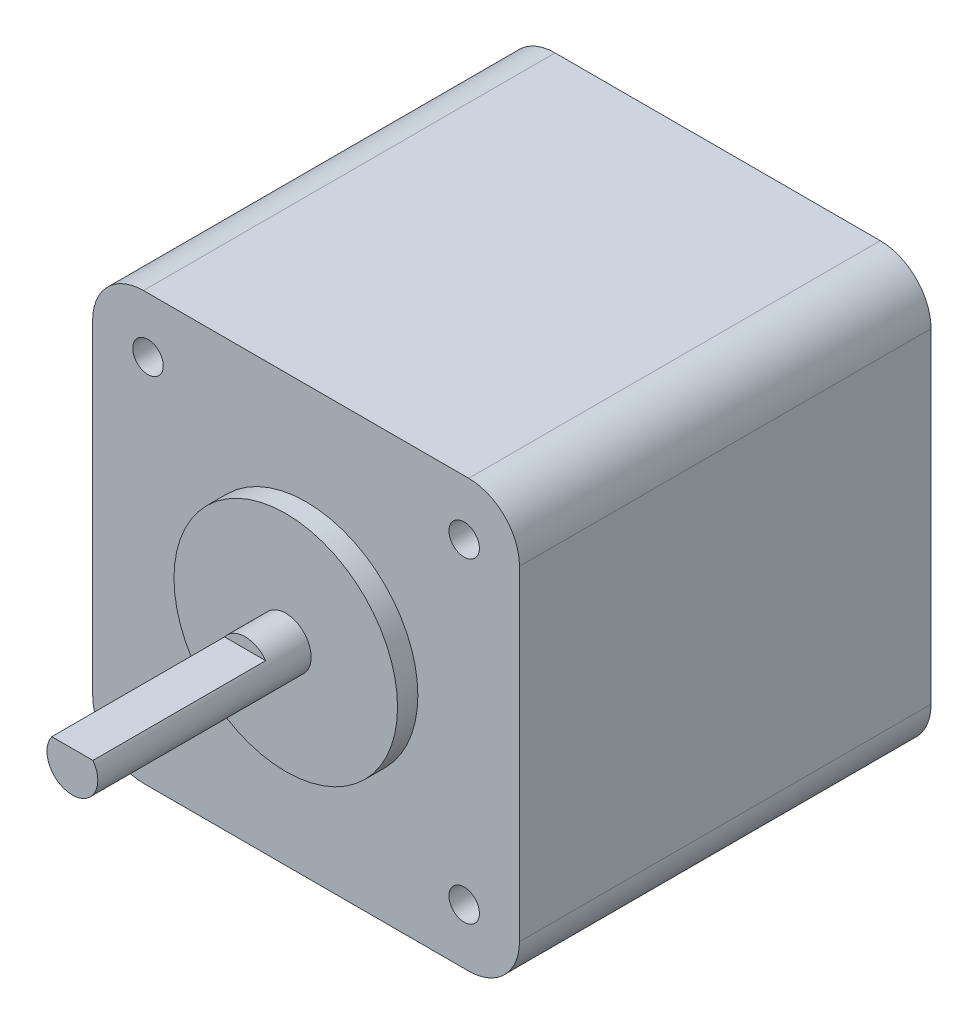
ISO-10303-21;
HEADER;
FILE_DESCRIPTION(('STEP AP214'),'2;1');
FILE_NAME('part.step','',(''),(''),'','','');
FILE_SCHEMA(('AUTOMOTIVE_DESIGN { 1 0 10303 214 1 1 1 1 }'));
ENDSEC;
DATA;
#1=APPLICATION_CONTEXT('core data for automotive mechanical design processes');
#2=APPLICATION_PROTOCOL_DEFINITION('international standard','automotive_design',2000,#1);
#3=PRODUCT_CONTEXT('',#1,'mechanical');
#4=PRODUCT('Part','Part','',(#3));
#5=PRODUCT_RELATED_PRODUCT_CATEGORY('part','',(#4));
#6=PRODUCT_DEFINITION_FORMATION('','',#4);
#7=PRODUCT_DEFINITION_CONTEXT('part definition',#1,'design');
#8=PRODUCT_DEFINITION('design','',#6,#7);
#9=PRODUCT_DEFINITION_SHAPE('','',#8);
#10=(LENGTH_UNIT() NAMED_UNIT(*) SI_UNIT(.MILLI.,.METRE.));
#11=(NAMED_UNIT(*) PLANE_ANGLE_UNIT() SI_UNIT($,.RADIAN.));
#12=(NAMED_UNIT(*) SI_UNIT($,.STERADIAN.) SOLID_ANGLE_UNIT());
#13=UNCERTAINTY_MEASURE_WITH_UNIT(LENGTH_MEASURE(1.E-05),#10,'distance_accuracy_value','');
#14=(GEOMETRIC_REPRESENTATION_CONTEXT(3) GLOBAL_UNCERTAINTY_ASSIGNED_CONTEXT((#13)) GLOBAL_UNIT_ASSIGNED_CONTEXT((#10,
#11,#12)) REPRESENTATION_CONTEXT('',''));
#15=CARTESIAN_POINT('',(0.,0.,0.));
#16=DIRECTION('',(0.,0.,1.));
#17=DIRECTION('',(1.,0.,0.));
#18=AXIS2_PLACEMENT_3D('',#15,#16,#17);
#19=CARTESIAN_POINT('',(21.,-21.,40.5));
#20=DIRECTION('',(-1.,0.,0.));
#21=DIRECTION('',(0.,0.,1.));
#22=AXIS2_PLACEMENT_3D('',#19,#20,#21);
#23=PLANE('',#22);
#24=DIRECTION('',(0.,1.,0.));
#25=VECTOR('',#24,1.);
#26=CARTESIAN_POINT('',(21.,-21.,40.5));
#27=LINE('',#26,#25);
#28=CARTESIAN_POINT('',(21.,-16.,40.5));
#29=VERTEX_POINT('',#28);
#30=CARTESIAN_POINT('',(21.,16.,40.5));
#31=VERTEX_POINT('',#30);
#32=EDGE_CURVE('E163',#29,#31,#27,.T.);
#33=ORIENTED_EDGE('',*,*,#32,.F.);
#34=DIRECTION('',(0.,0.,-1.));
#35=VECTOR('',#34,1.);
#36=CARTESIAN_POINT('',(21.,-16.,40.5));
#37=LINE('',#36,#35);
#38=CARTESIAN_POINT('',(21.,-16.,0.));
#39=VERTEX_POINT('',#38);
#40=EDGE_CURVE('E215',#29,#39,#37,.T.);
#41=ORIENTED_EDGE('',*,*,#40,.T.);
#42=DIRECTION('',(0.,1.,0.));
#43=VECTOR('',#42,1.);
#44=CARTESIAN_POINT('',(21.,-21.,0.));
#45=LINE('',#44,#43);
#46=CARTESIAN_POINT('',(21.,16.,0.));
#47=VERTEX_POINT('',#46);
#48=EDGE_CURVE('E162',#39,#47,#45,.T.);
#49=ORIENTED_EDGE('',*,*,#48,.T.);
#50=DIRECTION('',(0.,0.,-1.));
#51=VECTOR('',#50,1.);
#52=CARTESIAN_POINT('',(21.,16.,40.5));
#53=LINE('',#52,#51);
#54=EDGE_CURVE('E213',#47,#31,#53,.F.);
#55=ORIENTED_EDGE('',*,*,#54,.T.);
#56=EDGE_LOOP('',(#33,#41,#49,#55));
#57=FACE_BOUND('',#56,.T.);
#58=ADVANCED_FACE('F33',(#57),#23,.F.);
#59=CARTESIAN_POINT('',(-21.,21.,40.5));
#60=DIRECTION('',(0.,-1.,0.));
#61=DIRECTION('',(0.,0.,-1.));
#62=AXIS2_PLACEMENT_3D('',#59,#60,#61);
#63=PLANE('',#62);
#64=DIRECTION('',(-1.,0.,0.));
#65=VECTOR('',#64,1.);
#66=CARTESIAN_POINT('',(-21.,21.,40.5));
#67=LINE('',#66,#65);
#68=CARTESIAN_POINT('',(16.,21.,40.5));
#69=VERTEX_POINT('',#68);
#70=CARTESIAN_POINT('',(-16.,21.,40.5));
#71=VERTEX_POINT('',#70);
#72=EDGE_CURVE('E166',#69,#71,#67,.T.);
#73=ORIENTED_EDGE('',*,*,#72,.F.);
#74=DIRECTION('',(0.,0.,-1.));
#75=VECTOR('',#74,1.);
#76=CARTESIAN_POINT('',(16.,21.,40.5));
#77=LINE('',#76,#75);
#78=CARTESIAN_POINT('',(16.,21.,0.));
#79=VERTEX_POINT('',#78);
#80=EDGE_CURVE('E11',#69,#79,#77,.T.);
#81=ORIENTED_EDGE('',*,*,#80,.T.);
#82=DIRECTION('',(-1.,0.,0.));
#83=VECTOR('',#82,1.);
#84=CARTESIAN_POINT('',(-21.,21.,0.));
#85=LINE('',#84,#83);
#86=CARTESIAN_POINT('',(-16.,21.,0.));
#87=VERTEX_POINT('',#86);
#88=EDGE_CURVE('E178',#79,#87,#85,.T.);
#89=ORIENTED_EDGE('',*,*,#88,.T.);
#90=DIRECTION('',(0.,0.,-1.));
#91=VECTOR('',#90,1.);
#92=CARTESIAN_POINT('',(-16.,21.,40.5));
#93=LINE('',#92,#91);
#94=EDGE_CURVE('E41',#87,#71,#93,.F.);
#95=ORIENTED_EDGE('',*,*,#94,.T.);
#96=EDGE_LOOP('',(#73,#81,#89,#95));
#97=FACE_BOUND('',#96,.T.);
#98=ADVANCED_FACE('F232',(#97),#63,.F.);
#99=CARTESIAN_POINT('',(-21.,-21.,40.5));
#100=DIRECTION('',(1.,0.,0.));
#101=DIRECTION('',(0.,0.,-1.));
#102=AXIS2_PLACEMENT_3D('',#99,#100,#101);
#103=PLANE('',#102);
#104=DIRECTION('',(0.,-1.,0.));
#105=VECTOR('',#104,1.);
#106=CARTESIAN_POINT('',(-21.,-21.,0.));
#107=LINE('',#106,#105);
#108=CARTESIAN_POINT('',(-21.,16.,0.));
#109=VERTEX_POINT('',#108);
#110=CARTESIAN_POINT('',(-21.,-16.,0.));
#111=VERTEX_POINT('',#110);
#112=EDGE_CURVE('E180',#109,#111,#107,.T.);
#113=ORIENTED_EDGE('',*,*,#112,.T.);
#114=DIRECTION('',(0.,0.,-1.));
#115=VECTOR('',#114,1.);
#116=CARTESIAN_POINT('',(-21.,-16.,40.5));
#117=LINE('',#116,#115);
#118=CARTESIAN_POINT('',(-21.,-16.,40.5));
#119=VERTEX_POINT('',#118);
#120=EDGE_CURVE('E203',#111,#119,#117,.F.);
#121=ORIENTED_EDGE('',*,*,#120,.T.);
#122=DIRECTION('',(0.,-1.,0.));
#123=VECTOR('',#122,1.);
#124=CARTESIAN_POINT('',(-21.,-21.,40.5));
#125=LINE('',#124,#123);
#126=CARTESIAN_POINT('',(-21.,16.,40.5));
#127=VERTEX_POINT('',#126);
#128=EDGE_CURVE('E169',#127,#119,#125,.T.);
#129=ORIENTED_EDGE('',*,*,#128,.F.);
#130=DIRECTION('',(0.,0.,-1.));
#131=VECTOR('',#130,1.);
#132=CARTESIAN_POINT('',(-21.,16.,40.5));
#133=LINE('',#132,#131);
#134=EDGE_CURVE('E200',#127,#109,#133,.T.);
#135=ORIENTED_EDGE('',*,*,#134,.T.);
#136=EDGE_LOOP('',(#113,#121,#129,#135));
#137=FACE_BOUND('',#136,.T.);
#138=ADVANCED_FACE('F241',(#137),#103,.F.);
#139=CARTESIAN_POINT('',(-21.,-21.,40.5));
#140=DIRECTION('',(0.,1.,0.));
#141=DIRECTION('',(0.,0.,1.));
#142=AXIS2_PLACEMENT_3D('',#139,#140,#141);
#143=PLANE('',#142);
#144=DIRECTION('',(1.,0.,0.));
#145=VECTOR('',#144,1.);
#146=CARTESIAN_POINT('',(-21.,-21.,40.5));
#147=LINE('',#146,#145);
#148=CARTESIAN_POINT('',(-16.,-21.,40.5));
#149=VERTEX_POINT('',#148);
#150=CARTESIAN_POINT('',(16.,-21.,40.5));
#151=VERTEX_POINT('',#150);
#152=EDGE_CURVE('E172',#149,#151,#147,.T.);
#153=ORIENTED_EDGE('',*,*,#152,.F.);
#154=DIRECTION('',(0.,0.,-1.));
#155=VECTOR('',#154,1.);
#156=CARTESIAN_POINT('',(-16.,-21.,40.5));
#157=LINE('',#156,#155);
#158=CARTESIAN_POINT('',(-16.,-21.,0.));
#159=VERTEX_POINT('',#158);
#160=EDGE_CURVE('E189',#149,#159,#157,.T.);
#161=ORIENTED_EDGE('',*,*,#160,.T.);
#162=DIRECTION('',(1.,0.,0.));
#163=VECTOR('',#162,1.);
#164=CARTESIAN_POINT('',(-21.,-21.,0.));
#165=LINE('',#164,#163);
#166=CARTESIAN_POINT('',(16.,-21.,0.));
#167=VERTEX_POINT('',#166);
#168=EDGE_CURVE('E167',#159,#167,#165,.T.);
#169=ORIENTED_EDGE('',*,*,#168,.T.);
#170=DIRECTION('',(0.,0.,-1.));
#171=VECTOR('',#170,1.);
#172=CARTESIAN_POINT('',(16.,-21.,40.5));
#173=LINE('',#172,#171);
#174=EDGE_CURVE('E187',#167,#151,#173,.F.);
#175=ORIENTED_EDGE('',*,*,#174,.T.);
#176=EDGE_LOOP('',(#153,#161,#169,#175));
#177=FACE_BOUND('',#176,.T.);
#178=ADVANCED_FACE('F249',(#177),#143,.F.);
#179=CARTESIAN_POINT('',(0.,0.,40.5));
#180=DIRECTION('',(0.,0.,-1.));
#181=DIRECTION('',(-1.,0.,0.));
#182=AXIS2_PLACEMENT_3D('',#179,#180,#181);
#183=PLANE('',#182);
#184=CARTESIAN_POINT('',(-15.5563491861041,15.556349186104,40.5));
#185=DIRECTION('',(0.,0.,1.));
#186=DIRECTION('',(1.,0.,0.));
#187=AXIS2_PLACEMENT_3D('',#184,#185,#186);
#188=CIRCLE('',#187,1.5);
#189=CARTESIAN_POINT('',(-14.0563491861041,15.556349186104,40.5));
#190=VERTEX_POINT('',#189);
#191=EDGE_CURVE('E128',#190,#190,#188,.T.);
#192=ORIENTED_EDGE('',*,*,#191,.F.);
#193=EDGE_LOOP('',(#192));
#194=FACE_BOUND('',#193,.T.);
#195=CARTESIAN_POINT('',(15.5563491861041,-15.556349186104,40.5));
#196=DIRECTION('',(0.,0.,1.));
#197=DIRECTION('',(1.,0.,0.));
#198=AXIS2_PLACEMENT_3D('',#195,#196,#197);
#199=CIRCLE('',#198,1.5);
#200=CARTESIAN_POINT('',(17.0563491861041,-15.556349186104,40.5));
#201=VERTEX_POINT('',#200);
#202=EDGE_CURVE('E136',#201,#201,#199,.T.);
#203=ORIENTED_EDGE('',*,*,#202,.F.);
#204=EDGE_LOOP('',(#203));
#205=FACE_BOUND('',#204,.T.);
#206=CARTESIAN_POINT('',(-15.5563491861041,-15.556349186104,40.5));
#207=DIRECTION('',(0.,0.,1.));
#208=DIRECTION('',(1.,0.,0.));
#209=AXIS2_PLACEMENT_3D('',#206,#207,#208);
#210=CIRCLE('',#209,1.5);
#211=CARTESIAN_POINT('',(-14.0563491861041,-15.556349186104,40.5));
#212=VERTEX_POINT('',#211);
#213=EDGE_CURVE('E135',#212,#212,#210,.T.);
#214=ORIENTED_EDGE('',*,*,#213,.F.);
#215=EDGE_LOOP('',(#214));
#216=FACE_BOUND('',#215,.T.);
#217=CARTESIAN_POINT('',(15.5563491861041,15.556349186104,40.5));
#218=DIRECTION('',(0.,0.,1.));
#219=DIRECTION('',(1.,0.,0.));
#220=AXIS2_PLACEMENT_3D('',#217,#218,#219);
#221=CIRCLE('',#220,1.5);
#222=CARTESIAN_POINT('',(17.0563491861041,15.556349186104,40.5));
#223=VERTEX_POINT('',#222);
#224=EDGE_CURVE('E147',#223,#223,#221,.T.);
#225=ORIENTED_EDGE('',*,*,#224,.F.);
#226=EDGE_LOOP('',(#225));
#227=FACE_BOUND('',#226,.T.);
#228=CARTESIAN_POINT('',(0.,0.,40.5));
#229=DIRECTION('',(0.,0.,-1.));
#230=DIRECTION('',(-1.,0.,0.));
#231=AXIS2_PLACEMENT_3D('',#228,#229,#230);
#232=CIRCLE('',#231,11.);
#233=CARTESIAN_POINT('',(-11.,0.,40.5));
#234=VERTEX_POINT('',#233);
#235=EDGE_CURVE('E175',#234,#234,#232,.F.);
#236=ORIENTED_EDGE('',*,*,#235,.F.);
#237=EDGE_LOOP('',(#236));
#238=FACE_BOUND('',#237,.T.);
#239=ORIENTED_EDGE('',*,*,#128,.T.);
#240=CARTESIAN_POINT('',(-16.,-16.,40.5));
#241=DIRECTION('',(0.,0.,-1.));
#242=DIRECTION('',(-1.,0.,0.));
#243=AXIS2_PLACEMENT_3D('',#240,#241,#242);
#244=CIRCLE('',#243,5.);
#245=EDGE_CURVE('E211',#119,#149,#244,.F.);
#246=ORIENTED_EDGE('',*,*,#245,.T.);
#247=ORIENTED_EDGE('',*,*,#152,.T.);
#248=CARTESIAN_POINT('',(16.,-16.,40.5));
#249=DIRECTION('',(0.,0.,-1.));
#250=DIRECTION('',(-1.,0.,0.));
#251=AXIS2_PLACEMENT_3D('',#248,#249,#250);
#252=CIRCLE('',#251,5.);
#253=EDGE_CURVE('E209',#151,#29,#252,.F.);
#254=ORIENTED_EDGE('',*,*,#253,.T.);
#255=ORIENTED_EDGE('',*,*,#32,.T.);
#256=CARTESIAN_POINT('',(16.,16.,40.5));
#257=DIRECTION('',(0.,0.,-1.));
#258=DIRECTION('',(-1.,0.,0.));
#259=AXIS2_PLACEMENT_3D('',#256,#257,#258);
#260=CIRCLE('',#259,5.);
#261=EDGE_CURVE('E207',#31,#69,#260,.F.);
#262=ORIENTED_EDGE('',*,*,#261,.T.);
#263=ORIENTED_EDGE('',*,*,#72,.T.);
#264=CARTESIAN_POINT('',(-16.,16.,40.5));
#265=DIRECTION('',(0.,0.,-1.));
#266=DIRECTION('',(-1.,0.,0.));
#267=AXIS2_PLACEMENT_3D('',#264,#265,#266);
#268=CIRCLE('',#267,5.);
#269=EDGE_CURVE('E205',#71,#127,#268,.F.);
#270=ORIENTED_EDGE('',*,*,#269,.T.);
#271=EDGE_LOOP('',(#239,#246,#247,#254,#255,#262,#263,#270));
#272=FACE_BOUND('',#271,.T.);
#273=ADVANCED_FACE('F235',(#194,#205,#216,#227,#238,#272),#183,.F.);
#274=CARTESIAN_POINT('',(0.,0.,0.));
#275=DIRECTION('',(0.,0.,-1.));
#276=DIRECTION('',(-1.,0.,0.));
#277=AXIS2_PLACEMENT_3D('',#274,#275,#276);
#278=PLANE('',#277);
#279=ORIENTED_EDGE('',*,*,#168,.F.);
#280=CARTESIAN_POINT('',(-16.,-16.,0.));
#281=DIRECTION('',(0.,0.,-1.));
#282=DIRECTION('',(-1.,0.,0.));
#283=AXIS2_PLACEMENT_3D('',#280,#281,#282);
#284=CIRCLE('',#283,5.);
#285=EDGE_CURVE('E198',#159,#111,#284,.T.);
#286=ORIENTED_EDGE('',*,*,#285,.T.);
#287=ORIENTED_EDGE('',*,*,#112,.F.);
#288=CARTESIAN_POINT('',(-16.,16.,0.));
#289=DIRECTION('',(0.,0.,-1.));
#290=DIRECTION('',(-1.,0.,0.));
#291=AXIS2_PLACEMENT_3D('',#288,#289,#290);
#292=CIRCLE('',#291,5.);
#293=EDGE_CURVE('E192',#109,#87,#292,.T.);
#294=ORIENTED_EDGE('',*,*,#293,.T.);
#295=ORIENTED_EDGE('',*,*,#88,.F.);
#296=CARTESIAN_POINT('',(16.,16.,0.));
#297=DIRECTION('',(0.,0.,-1.));
#298=DIRECTION('',(-1.,0.,0.));
#299=AXIS2_PLACEMENT_3D('',#296,#297,#298);
#300=CIRCLE('',#299,5.);
#301=EDGE_CURVE('E194',#79,#47,#300,.T.);
#302=ORIENTED_EDGE('',*,*,#301,.T.);
#303=ORIENTED_EDGE('',*,*,#48,.F.);
#304=CARTESIAN_POINT('',(16.,-16.,0.));
#305=DIRECTION('',(0.,0.,-1.));
#306=DIRECTION('',(-1.,0.,0.));
#307=AXIS2_PLACEMENT_3D('',#304,#305,#306);
#308=CIRCLE('',#307,5.);
#309=EDGE_CURVE('E196',#39,#167,#308,.T.);
#310=ORIENTED_EDGE('',*,*,#309,.T.);
#311=EDGE_LOOP('',(#279,#286,#287,#294,#295,#302,#303,#310));
#312=FACE_BOUND('',#311,.T.);
#313=ADVANCED_FACE('F226',(#312),#278,.T.);
#314=CARTESIAN_POINT('',(0.,0.,42.5));
#315=DIRECTION('',(0.,0.,-1.));
#316=DIRECTION('',(-1.,0.,0.));
#317=AXIS2_PLACEMENT_3D('',#314,#315,#316);
#318=CYLINDRICAL_SURFACE('',#317,11.);
#319=CARTESIAN_POINT('',(0.,0.,42.5));
#320=DIRECTION('',(0.,0.,1.));
#321=DIRECTION('',(1.,0.,0.));
#322=AXIS2_PLACEMENT_3D('',#319,#320,#321);
#323=CIRCLE('',#322,11.);
#324=CARTESIAN_POINT('',(11.,0.,42.5));
#325=VERTEX_POINT('',#324);
#326=EDGE_CURVE('E157',#325,#325,#323,.T.);
#327=ORIENTED_EDGE('',*,*,#326,.F.);
#328=EDGE_LOOP('',(#327));
#329=FACE_BOUND('',#328,.T.);
#330=ORIENTED_EDGE('',*,*,#235,.T.);
#331=EDGE_LOOP('',(#330));
#332=FACE_BOUND('',#331,.T.);
#333=ADVANCED_FACE('F273',(#329,#332),#318,.T.);
#334=CARTESIAN_POINT('',(0.,0.,42.5));
#335=DIRECTION('',(0.,0.,1.));
#336=DIRECTION('',(1.,0.,0.));
#337=AXIS2_PLACEMENT_3D('',#334,#335,#336);
#338=PLANE('',#337);
#339=CARTESIAN_POINT('',(0.,0.,42.5));
#340=DIRECTION('',(0.,0.,1.));
#341=DIRECTION('',(1.,0.,0.));
#342=AXIS2_PLACEMENT_3D('',#339,#340,#341);
#343=CIRCLE('',#342,2.5);
#344=CARTESIAN_POINT('',(2.5,0.,42.5));
#345=VERTEX_POINT('',#344);
#346=EDGE_CURVE('E153',#345,#345,#343,.T.);
#347=ORIENTED_EDGE('',*,*,#346,.F.);
#348=EDGE_LOOP('',(#347));
#349=FACE_BOUND('',#348,.T.);
#350=ORIENTED_EDGE('',*,*,#326,.T.);
#351=EDGE_LOOP('',(#350));
#352=FACE_BOUND('',#351,.T.);
#353=ADVANCED_FACE('F279',(#349,#352),#338,.T.);
#354=CARTESIAN_POINT('',(0.,0.,63.5));
#355=DIRECTION('',(0.,0.,-1.));
#356=DIRECTION('',(-1.,0.,0.));
#357=AXIS2_PLACEMENT_3D('',#354,#355,#356);
#358=CYLINDRICAL_SURFACE('',#357,2.5);
#359=CARTESIAN_POINT('',(0.,0.,63.5));
#360=DIRECTION('',(0.,0.,1.));
#361=DIRECTION('',(1.,0.,0.));
#362=AXIS2_PLACEMENT_3D('',#359,#360,#361);
#363=CIRCLE('',#362,2.5);
#364=CARTESIAN_POINT('',(-2.02466671372052,1.46653492912789,63.5));
#365=VERTEX_POINT('',#364);
#366=CARTESIAN_POINT('',(2.02466671372052,1.46653492912789,63.5));
#367=VERTEX_POINT('',#366);
#368=EDGE_CURVE('E126',#365,#367,#363,.T.);
#369=ORIENTED_EDGE('',*,*,#368,.F.);
#370=DIRECTION('',(0.,0.,1.));
#371=VECTOR('',#370,1.);
#372=CARTESIAN_POINT('',(-2.02466671372052,1.46653492912789,46.5));
#373=LINE('',#372,#371);
#374=CARTESIAN_POINT('',(-2.02466671372052,1.46653492912789,46.5));
#375=VERTEX_POINT('',#374);
#376=EDGE_CURVE('E48',#375,#365,#373,.T.);
#377=ORIENTED_EDGE('',*,*,#376,.F.);
#378=CARTESIAN_POINT('',(0.,0.,46.5));
#379=DIRECTION('',(0.,0.,1.));
#380=DIRECTION('',(1.,0.,0.));
#381=AXIS2_PLACEMENT_3D('',#378,#379,#380);
#382=CIRCLE('',#381,2.5);
#383=CARTESIAN_POINT('',(2.02466671372052,1.46653492912789,46.5));
#384=VERTEX_POINT('',#383);
#385=EDGE_CURVE('E112',#384,#375,#382,.T.);
#386=ORIENTED_EDGE('',*,*,#385,.F.);
#387=DIRECTION('',(0.,0.,1.));
#388=VECTOR('',#387,1.);
#389=CARTESIAN_POINT('',(2.02466671372052,1.46653492912789,46.5));
#390=LINE('',#389,#388);
#391=EDGE_CURVE('E120',#384,#367,#390,.T.);
#392=ORIENTED_EDGE('',*,*,#391,.T.);
#393=EDGE_LOOP('',(#369,#377,#386,#392));
#394=FACE_BOUND('',#393,.T.);
#395=ORIENTED_EDGE('',*,*,#346,.T.);
#396=EDGE_LOOP('',(#395));
#397=FACE_BOUND('',#396,.T.);
#398=ADVANCED_FACE('F123',(#394,#397),#358,.T.);
#399=CARTESIAN_POINT('',(0.,0.,63.5));
#400=DIRECTION('',(0.,0.,1.));
#401=DIRECTION('',(1.,0.,0.));
#402=AXIS2_PLACEMENT_3D('',#399,#400,#401);
#403=PLANE('',#402);
#404=DIRECTION('',(1.,0.,0.));
#405=VECTOR('',#404,1.);
#406=CARTESIAN_POINT('',(-2.02466671372052,1.46653492912789,63.5));
#407=LINE('',#406,#405);
#408=EDGE_CURVE('E117',#365,#367,#407,.T.);
#409=ORIENTED_EDGE('',*,*,#408,.F.);
#410=ORIENTED_EDGE('',*,*,#368,.T.);
#411=EDGE_LOOP('',(#409,#410));
#412=FACE_BOUND('',#411,.T.);
#413=ADVANCED_FACE('F258',(#412),#403,.T.);
#414=CARTESIAN_POINT('',(-16.,-16.,40.5));
#415=DIRECTION('',(0.,0.,-1.));
#416=DIRECTION('',(-1.,0.,0.));
#417=AXIS2_PLACEMENT_3D('',#414,#415,#416);
#418=CYLINDRICAL_SURFACE('',#417,5.);
#419=ORIENTED_EDGE('',*,*,#245,.F.);
#420=ORIENTED_EDGE('',*,*,#120,.F.);
#421=ORIENTED_EDGE('',*,*,#285,.F.);
#422=ORIENTED_EDGE('',*,*,#160,.F.);
#423=EDGE_LOOP('',(#419,#420,#421,#422));
#424=FACE_BOUND('',#423,.T.);
#425=ADVANCED_FACE('F246',(#424),#418,.T.);
#426=CARTESIAN_POINT('',(16.,-16.,40.5));
#427=DIRECTION('',(0.,0.,-1.));
#428=DIRECTION('',(-1.,0.,0.));
#429=AXIS2_PLACEMENT_3D('',#426,#427,#428);
#430=CYLINDRICAL_SURFACE('',#429,5.);
#431=ORIENTED_EDGE('',*,*,#253,.F.);
#432=ORIENTED_EDGE('',*,*,#174,.F.);
#433=ORIENTED_EDGE('',*,*,#309,.F.);
#434=ORIENTED_EDGE('',*,*,#40,.F.);
#435=EDGE_LOOP('',(#431,#432,#433,#434));
#436=FACE_BOUND('',#435,.T.);
#437=ADVANCED_FACE('F251',(#436),#430,.T.);
#438=CARTESIAN_POINT('',(16.,16.,40.5));
#439=DIRECTION('',(0.,0.,-1.));
#440=DIRECTION('',(-1.,0.,0.));
#441=AXIS2_PLACEMENT_3D('',#438,#439,#440);
#442=CYLINDRICAL_SURFACE('',#441,5.);
#443=ORIENTED_EDGE('',*,*,#261,.F.);
#444=ORIENTED_EDGE('',*,*,#54,.F.);
#445=ORIENTED_EDGE('',*,*,#301,.F.);
#446=ORIENTED_EDGE('',*,*,#80,.F.);
#447=EDGE_LOOP('',(#443,#444,#445,#446));
#448=FACE_BOUND('',#447,.T.);
#449=ADVANCED_FACE('F231',(#448),#442,.T.);
#450=CARTESIAN_POINT('',(-16.,16.,40.5));
#451=DIRECTION('',(0.,0.,-1.));
#452=DIRECTION('',(-1.,0.,0.));
#453=AXIS2_PLACEMENT_3D('',#450,#451,#452);
#454=CYLINDRICAL_SURFACE('',#453,5.);
#455=ORIENTED_EDGE('',*,*,#269,.F.);
#456=ORIENTED_EDGE('',*,*,#94,.F.);
#457=ORIENTED_EDGE('',*,*,#293,.F.);
#458=ORIENTED_EDGE('',*,*,#134,.F.);
#459=EDGE_LOOP('',(#455,#456,#457,#458));
#460=FACE_BOUND('',#459,.T.);
#461=ADVANCED_FACE('F35',(#460),#454,.T.);
#462=CARTESIAN_POINT('',(15.5563491861041,15.556349186104,30.5));
#463=DIRECTION('',(0.,0.,1.));
#464=DIRECTION('',(1.,0.,0.));
#465=AXIS2_PLACEMENT_3D('',#462,#463,#464);
#466=CYLINDRICAL_SURFACE('',#465,1.5);
#467=CARTESIAN_POINT('',(15.5563491861041,15.556349186104,30.5));
#468=DIRECTION('',(0.,0.,1.));
#469=DIRECTION('',(1.,0.,0.));
#470=AXIS2_PLACEMENT_3D('',#467,#468,#469);
#471=CIRCLE('',#470,1.5);
#472=CARTESIAN_POINT('',(17.0563491861041,15.556349186104,30.5));
#473=VERTEX_POINT('',#472);
#474=EDGE_CURVE('E150',#473,#473,#471,.T.);
#475=ORIENTED_EDGE('',*,*,#474,.F.);
#476=EDGE_LOOP('',(#475));
#477=FACE_BOUND('',#476,.T.);
#478=ORIENTED_EDGE('',*,*,#224,.T.);
#479=EDGE_LOOP('',(#478));
#480=FACE_BOUND('',#479,.T.);
#481=ADVANCED_FACE('F289',(#477,#480),#466,.F.);
#482=CARTESIAN_POINT('',(15.5563491861041,15.556349186104,30.5));
#483=DIRECTION('',(0.,0.,1.));
#484=DIRECTION('',(1.,0.,0.));
#485=AXIS2_PLACEMENT_3D('',#482,#483,#484);
#486=PLANE('',#485);
#487=ORIENTED_EDGE('',*,*,#474,.T.);
#488=EDGE_LOOP('',(#487));
#489=FACE_BOUND('',#488,.T.);
#490=ADVANCED_FACE('F292',(#489),#486,.T.);
#491=CARTESIAN_POINT('',(-15.5563491861041,-15.556349186104,30.5));
#492=DIRECTION('',(0.,0.,1.));
#493=DIRECTION('',(1.,0.,0.));
#494=AXIS2_PLACEMENT_3D('',#491,#492,#493);
#495=CYLINDRICAL_SURFACE('',#494,1.5);
#496=CARTESIAN_POINT('',(-15.5563491861041,-15.556349186104,30.5));
#497=DIRECTION('',(0.,0.,1.));
#498=DIRECTION('',(1.,0.,0.));
#499=AXIS2_PLACEMENT_3D('',#496,#497,#498);
#500=CIRCLE('',#499,1.5);
#501=CARTESIAN_POINT('',(-14.0563491861041,-15.556349186104,30.5));
#502=VERTEX_POINT('',#501);
#503=EDGE_CURVE('E144',#502,#502,#500,.T.);
#504=ORIENTED_EDGE('',*,*,#503,.F.);
#505=EDGE_LOOP('',(#504));
#506=FACE_BOUND('',#505,.T.);
#507=ORIENTED_EDGE('',*,*,#213,.T.);
#508=EDGE_LOOP('',(#507));
#509=FACE_BOUND('',#508,.T.);
#510=ADVANCED_FACE('F296',(#506,#509),#495,.F.);
#511=CARTESIAN_POINT('',(-15.5563491861041,-15.556349186104,30.5));
#512=DIRECTION('',(0.,0.,1.));
#513=DIRECTION('',(1.,0.,0.));
#514=AXIS2_PLACEMENT_3D('',#511,#512,#513);
#515=PLANE('',#514);
#516=ORIENTED_EDGE('',*,*,#503,.T.);
#517=EDGE_LOOP('',(#516));
#518=FACE_BOUND('',#517,.T.);
#519=ADVANCED_FACE('F300',(#518),#515,.T.);
#520=CARTESIAN_POINT('',(15.5563491861041,-15.556349186104,30.5));
#521=DIRECTION('',(0.,0.,1.));
#522=DIRECTION('',(1.,0.,0.));
#523=AXIS2_PLACEMENT_3D('',#520,#521,#522);
#524=CYLINDRICAL_SURFACE('',#523,1.5);
#525=CARTESIAN_POINT('',(15.5563491861041,-15.556349186104,30.5));
#526=DIRECTION('',(0.,0.,1.));
#527=DIRECTION('',(1.,0.,0.));
#528=AXIS2_PLACEMENT_3D('',#525,#526,#527);
#529=CIRCLE('',#528,1.5);
#530=CARTESIAN_POINT('',(17.0563491861041,-15.556349186104,30.5));
#531=VERTEX_POINT('',#530);
#532=EDGE_CURVE('E132',#531,#531,#529,.T.);
#533=ORIENTED_EDGE('',*,*,#532,.F.);
#534=EDGE_LOOP('',(#533));
#535=FACE_BOUND('',#534,.T.);
#536=ORIENTED_EDGE('',*,*,#202,.T.);
#537=EDGE_LOOP('',(#536));
#538=FACE_BOUND('',#537,.T.);
#539=ADVANCED_FACE('F304',(#535,#538),#524,.F.);
#540=CARTESIAN_POINT('',(15.5563491861041,-15.556349186104,30.5));
#541=DIRECTION('',(0.,0.,1.));
#542=DIRECTION('',(1.,0.,0.));
#543=AXIS2_PLACEMENT_3D('',#540,#541,#542);
#544=PLANE('',#543);
#545=ORIENTED_EDGE('',*,*,#532,.T.);
#546=EDGE_LOOP('',(#545));
#547=FACE_BOUND('',#546,.T.);
#548=ADVANCED_FACE('F310',(#547),#544,.T.);
#549=CARTESIAN_POINT('',(-15.5563491861041,15.556349186104,30.5));
#550=DIRECTION('',(0.,0.,1.));
#551=DIRECTION('',(1.,0.,0.));
#552=AXIS2_PLACEMENT_3D('',#549,#550,#551);
#553=CYLINDRICAL_SURFACE('',#552,1.5);
#554=CARTESIAN_POINT('',(-15.5563491861041,15.556349186104,30.5));
#555=DIRECTION('',(0.,0.,1.));
#556=DIRECTION('',(1.,0.,0.));
#557=AXIS2_PLACEMENT_3D('',#554,#555,#556);
#558=CIRCLE('',#557,1.5);
#559=CARTESIAN_POINT('',(-14.0563491861041,15.556349186104,30.5));
#560=VERTEX_POINT('',#559);
#561=EDGE_CURVE('E139',#560,#560,#558,.T.);
#562=ORIENTED_EDGE('',*,*,#561,.F.);
#563=EDGE_LOOP('',(#562));
#564=FACE_BOUND('',#563,.T.);
#565=ORIENTED_EDGE('',*,*,#191,.T.);
#566=EDGE_LOOP('',(#565));
#567=FACE_BOUND('',#566,.T.);
#568=ADVANCED_FACE('F306',(#564,#567),#553,.F.);
#569=CARTESIAN_POINT('',(-15.5563491861041,15.556349186104,30.5));
#570=DIRECTION('',(0.,0.,1.));
#571=DIRECTION('',(1.,0.,0.));
#572=AXIS2_PLACEMENT_3D('',#569,#570,#571);
#573=PLANE('',#572);
#574=ORIENTED_EDGE('',*,*,#561,.T.);
#575=EDGE_LOOP('',(#574));
#576=FACE_BOUND('',#575,.T.);
#577=ADVANCED_FACE('F309',(#576),#573,.T.);
#578=CARTESIAN_POINT('',(-2.02466671372052,1.46653492912789,46.5));
#579=DIRECTION('',(0.,-1.,0.));
#580=DIRECTION('',(0.,0.,-1.));
#581=AXIS2_PLACEMENT_3D('',#578,#579,#580);
#582=PLANE('',#581);
#583=ORIENTED_EDGE('',*,*,#408,.T.);
#584=ORIENTED_EDGE('',*,*,#391,.F.);
#585=DIRECTION('',(1.,0.,0.));
#586=VECTOR('',#585,1.);
#587=CARTESIAN_POINT('',(-2.02466671372052,1.46653492912789,46.5));
#588=LINE('',#587,#586);
#589=EDGE_CURVE('E114',#375,#384,#588,.T.);
#590=ORIENTED_EDGE('',*,*,#589,.F.);
#591=ORIENTED_EDGE('',*,*,#376,.T.);
#592=EDGE_LOOP('',(#583,#584,#590,#591));
#593=FACE_BOUND('',#592,.T.);
#594=ADVANCED_FACE('F119',(#593),#582,.F.);
#595=CARTESIAN_POINT('',(0.,0.,46.5));
#596=DIRECTION('',(0.,0.,1.));
#597=DIRECTION('',(1.,0.,0.));
#598=AXIS2_PLACEMENT_3D('',#595,#596,#597);
#599=PLANE('',#598);
#600=ORIENTED_EDGE('',*,*,#385,.T.);
#601=ORIENTED_EDGE('',*,*,#589,.T.);
#602=EDGE_LOOP('',(#600,#601));
#603=FACE_BOUND('',#602,.T.);
#604=ADVANCED_FACE('F113',(#603),#599,.T.);
#605=CLOSED_SHELL('',(#58,#98,#138,#178,#273,#313,#333,#353,#398,#413,#425,#437,#449,#461,#481,
#490,#510,#519,#539,#548,#568,#577,#594,#604));
#606=MANIFOLD_SOLID_BREP('B2',#605);
#607=ADVANCED_BREP_SHAPE_REPRESENTATION('',(#18,#606),#14);
#608=SHAPE_DEFINITION_REPRESENTATION(#9,#607);
ENDSEC;
END-ISO-10303-21;
